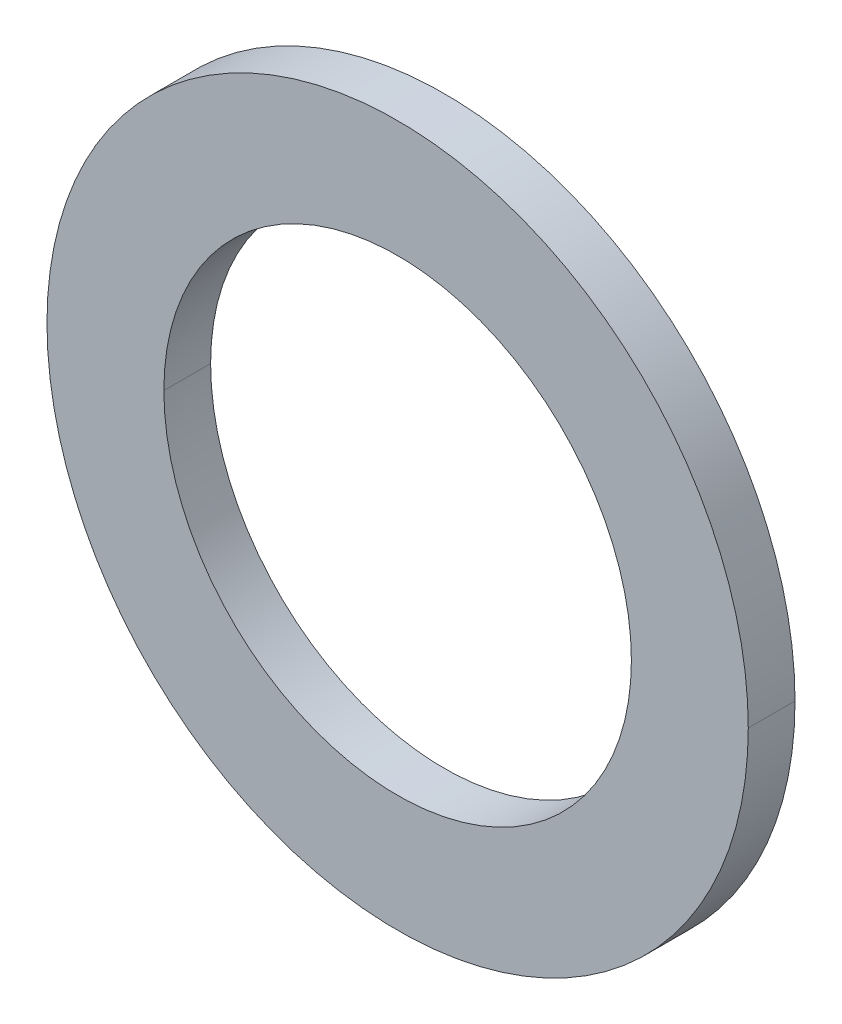
ISO-10303-21;
HEADER;
FILE_DESCRIPTION(('STEP AP214'),'2;1');
FILE_NAME('part.step','',(''),(''),'','','');
FILE_SCHEMA(('AUTOMOTIVE_DESIGN { 1 0 10303 214 1 1 1 1 }'));
ENDSEC;
DATA;
#1=APPLICATION_CONTEXT('core data for automotive mechanical design processes');
#2=APPLICATION_PROTOCOL_DEFINITION('international standard','automotive_design',2000,#1);
#3=PRODUCT_CONTEXT('',#1,'mechanical');
#4=PRODUCT('Part','Part','',(#3));
#5=PRODUCT_RELATED_PRODUCT_CATEGORY('part','',(#4));
#6=PRODUCT_DEFINITION_FORMATION('','',#4);
#7=PRODUCT_DEFINITION_CONTEXT('part definition',#1,'design');
#8=PRODUCT_DEFINITION('design','',#6,#7);
#9=PRODUCT_DEFINITION_SHAPE('','',#8);
#10=(LENGTH_UNIT() NAMED_UNIT(*) SI_UNIT(.MILLI.,.METRE.));
#11=(NAMED_UNIT(*) PLANE_ANGLE_UNIT() SI_UNIT($,.RADIAN.));
#12=(NAMED_UNIT(*) SI_UNIT($,.STERADIAN.) SOLID_ANGLE_UNIT());
#13=UNCERTAINTY_MEASURE_WITH_UNIT(LENGTH_MEASURE(1.E-05),#10,'distance_accuracy_value','');
#14=(GEOMETRIC_REPRESENTATION_CONTEXT(3) GLOBAL_UNCERTAINTY_ASSIGNED_CONTEXT((#13)) GLOBAL_UNIT_ASSIGNED_CONTEXT((#10,
#11,#12)) REPRESENTATION_CONTEXT('',''));
#15=CARTESIAN_POINT('',(0.,0.,0.));
#16=DIRECTION('',(0.,0.,1.));
#17=DIRECTION('',(1.,0.,0.));
#18=AXIS2_PLACEMENT_3D('',#15,#16,#17);
#19=CARTESIAN_POINT('',(0.,0.,1.));
#20=DIRECTION('',(0.,0.,-1.));
#21=DIRECTION('',(-1.,0.,0.));
#22=AXIS2_PLACEMENT_3D('',#19,#20,#21);
#23=CYLINDRICAL_SURFACE('',#22,10.);
#24=DIRECTION('',(0.,0.,-1.));
#25=VECTOR('',#24,1.);
#26=CARTESIAN_POINT('',(10.,0.,1.));
#27=LINE('',#26,#25);
#28=CARTESIAN_POINT('',(10.,0.,1.));
#29=VERTEX_POINT('',#28);
#30=CARTESIAN_POINT('',(10.,0.,-1.));
#31=VERTEX_POINT('',#30);
#32=EDGE_CURVE('E109',#29,#31,#27,.T.);
#33=ORIENTED_EDGE('',*,*,#32,.F.);
#34=CARTESIAN_POINT('',(0.,0.,1.));
#35=DIRECTION('',(0.,0.,1.));
#36=DIRECTION('',(1.,0.,0.));
#37=AXIS2_PLACEMENT_3D('',#34,#35,#36);
#38=CIRCLE('',#37,10.);
#39=CARTESIAN_POINT('',(-10.,0.,1.));
#40=VERTEX_POINT('',#39);
#41=EDGE_CURVE('E73',#29,#40,#38,.T.);
#42=ORIENTED_EDGE('',*,*,#41,.T.);
#43=DIRECTION('',(0.,0.,-1.));
#44=VECTOR('',#43,1.);
#45=CARTESIAN_POINT('',(-10.,0.,1.));
#46=LINE('',#45,#44);
#47=CARTESIAN_POINT('',(-10.,0.,-1.));
#48=VERTEX_POINT('',#47);
#49=EDGE_CURVE('E81',#40,#48,#46,.T.);
#50=ORIENTED_EDGE('',*,*,#49,.T.);
#51=CARTESIAN_POINT('',(0.,0.,-1.));
#52=DIRECTION('',(0.,0.,1.));
#53=DIRECTION('',(1.,0.,0.));
#54=AXIS2_PLACEMENT_3D('',#51,#52,#53);
#55=CIRCLE('',#54,10.);
#56=EDGE_CURVE('E10',#31,#48,#55,.T.);
#57=ORIENTED_EDGE('',*,*,#56,.F.);
#58=EDGE_LOOP('',(#33,#42,#50,#57));
#59=FACE_BOUND('',#58,.T.);
#60=ADVANCED_FACE('F15',(#59),#23,.F.);
#61=CARTESIAN_POINT('',(0.,0.,1.));
#62=DIRECTION('',(0.,0.,-1.));
#63=DIRECTION('',(-1.,0.,0.));
#64=AXIS2_PLACEMENT_3D('',#61,#62,#63);
#65=CYLINDRICAL_SURFACE('',#64,15.);
#66=DIRECTION('',(0.,0.,-1.));
#67=VECTOR('',#66,1.);
#68=CARTESIAN_POINT('',(15.,0.,1.));
#69=LINE('',#68,#67);
#70=CARTESIAN_POINT('',(15.,0.,1.));
#71=VERTEX_POINT('',#70);
#72=CARTESIAN_POINT('',(15.,0.,-1.));
#73=VERTEX_POINT('',#72);
#74=EDGE_CURVE('E68',#71,#73,#69,.T.);
#75=ORIENTED_EDGE('',*,*,#74,.F.);
#76=CARTESIAN_POINT('',(0.,0.,1.));
#77=DIRECTION('',(0.,0.,1.));
#78=DIRECTION('',(1.,0.,0.));
#79=AXIS2_PLACEMENT_3D('',#76,#77,#78);
#80=CIRCLE('',#79,15.);
#81=CARTESIAN_POINT('',(-15.,0.,1.));
#82=VERTEX_POINT('',#81);
#83=EDGE_CURVE('E62',#82,#71,#80,.T.);
#84=ORIENTED_EDGE('',*,*,#83,.F.);
#85=DIRECTION('',(0.,0.,-1.));
#86=VECTOR('',#85,1.);
#87=CARTESIAN_POINT('',(-15.,0.,1.));
#88=LINE('',#87,#86);
#89=CARTESIAN_POINT('',(-15.,0.,-1.));
#90=VERTEX_POINT('',#89);
#91=EDGE_CURVE('E65',#82,#90,#88,.T.);
#92=ORIENTED_EDGE('',*,*,#91,.T.);
#93=CARTESIAN_POINT('',(0.,0.,-1.));
#94=DIRECTION('',(0.,0.,1.));
#95=DIRECTION('',(1.,0.,0.));
#96=AXIS2_PLACEMENT_3D('',#93,#94,#95);
#97=CIRCLE('',#96,15.);
#98=EDGE_CURVE('E25',#90,#73,#97,.T.);
#99=ORIENTED_EDGE('',*,*,#98,.T.);
#100=EDGE_LOOP('',(#75,#84,#92,#99));
#101=FACE_BOUND('',#100,.T.);
#102=ADVANCED_FACE('F64',(#101),#65,.T.);
#103=CARTESIAN_POINT('',(0.,0.,-1.));
#104=DIRECTION('',(0.,0.,1.));
#105=DIRECTION('',(1.,0.,0.));
#106=AXIS2_PLACEMENT_3D('',#103,#104,#105);
#107=PLANE('',#106);
#108=CARTESIAN_POINT('',(0.,0.,-1.));
#109=DIRECTION('',(0.,0.,1.));
#110=DIRECTION('',(1.,0.,0.));
#111=AXIS2_PLACEMENT_3D('',#108,#109,#110);
#112=CIRCLE('',#111,10.);
#113=EDGE_CURVE('E90',#48,#31,#112,.T.);
#114=ORIENTED_EDGE('',*,*,#113,.T.);
#115=ORIENTED_EDGE('',*,*,#56,.T.);
#116=EDGE_LOOP('',(#114,#115));
#117=FACE_BOUND('',#116,.T.);
#118=ORIENTED_EDGE('',*,*,#98,.F.);
#119=CARTESIAN_POINT('',(0.,0.,-1.));
#120=DIRECTION('',(0.,0.,1.));
#121=DIRECTION('',(1.,0.,0.));
#122=AXIS2_PLACEMENT_3D('',#119,#120,#121);
#123=CIRCLE('',#122,15.);
#124=EDGE_CURVE('E18',#73,#90,#123,.T.);
#125=ORIENTED_EDGE('',*,*,#124,.F.);
#126=EDGE_LOOP('',(#118,#125));
#127=FACE_BOUND('',#126,.T.);
#128=ADVANCED_FACE('F124',(#117,#127),#107,.F.);
#129=CARTESIAN_POINT('',(0.,0.,1.));
#130=DIRECTION('',(0.,0.,1.));
#131=DIRECTION('',(1.,0.,0.));
#132=AXIS2_PLACEMENT_3D('',#129,#130,#131);
#133=PLANE('',#132);
#134=CARTESIAN_POINT('',(0.,0.,1.));
#135=DIRECTION('',(0.,0.,1.));
#136=DIRECTION('',(1.,0.,0.));
#137=AXIS2_PLACEMENT_3D('',#134,#135,#136);
#138=CIRCLE('',#137,10.);
#139=EDGE_CURVE('E93',#40,#29,#138,.T.);
#140=ORIENTED_EDGE('',*,*,#139,.F.);
#141=ORIENTED_EDGE('',*,*,#41,.F.);
#142=EDGE_LOOP('',(#140,#141));
#143=FACE_BOUND('',#142,.T.);
#144=ORIENTED_EDGE('',*,*,#83,.T.);
#145=CARTESIAN_POINT('',(0.,0.,1.));
#146=DIRECTION('',(0.,0.,1.));
#147=DIRECTION('',(1.,0.,0.));
#148=AXIS2_PLACEMENT_3D('',#145,#146,#147);
#149=CIRCLE('',#148,15.);
#150=EDGE_CURVE('E77',#71,#82,#149,.T.);
#151=ORIENTED_EDGE('',*,*,#150,.T.);
#152=EDGE_LOOP('',(#144,#151));
#153=FACE_BOUND('',#152,.T.);
#154=ADVANCED_FACE('F79',(#143,#153),#133,.T.);
#155=CARTESIAN_POINT('',(0.,0.,1.));
#156=DIRECTION('',(0.,0.,-1.));
#157=DIRECTION('',(-1.,0.,0.));
#158=AXIS2_PLACEMENT_3D('',#155,#156,#157);
#159=CYLINDRICAL_SURFACE('',#158,15.);
#160=ORIENTED_EDGE('',*,*,#150,.F.);
#161=ORIENTED_EDGE('',*,*,#74,.T.);
#162=ORIENTED_EDGE('',*,*,#124,.T.);
#163=ORIENTED_EDGE('',*,*,#91,.F.);
#164=EDGE_LOOP('',(#160,#161,#162,#163));
#165=FACE_BOUND('',#164,.T.);
#166=ADVANCED_FACE('F76',(#165),#159,.T.);
#167=CARTESIAN_POINT('',(0.,0.,1.));
#168=DIRECTION('',(0.,0.,-1.));
#169=DIRECTION('',(-1.,0.,0.));
#170=AXIS2_PLACEMENT_3D('',#167,#168,#169);
#171=CYLINDRICAL_SURFACE('',#170,10.);
#172=ORIENTED_EDGE('',*,*,#139,.T.);
#173=ORIENTED_EDGE('',*,*,#32,.T.);
#174=ORIENTED_EDGE('',*,*,#113,.F.);
#175=ORIENTED_EDGE('',*,*,#49,.F.);
#176=EDGE_LOOP('',(#172,#173,#174,#175));
#177=FACE_BOUND('',#176,.T.);
#178=ADVANCED_FACE('F121',(#177),#171,.F.);
#179=CLOSED_SHELL('',(#60,#102,#128,#154,#166,#178));
#180=MANIFOLD_SOLID_BREP('B1',#179);
#181=ADVANCED_BREP_SHAPE_REPRESENTATION('',(#18,#180),#14);
#182=SHAPE_DEFINITION_REPRESENTATION(#9,#181);
ENDSEC;
END-ISO-10303-21;
